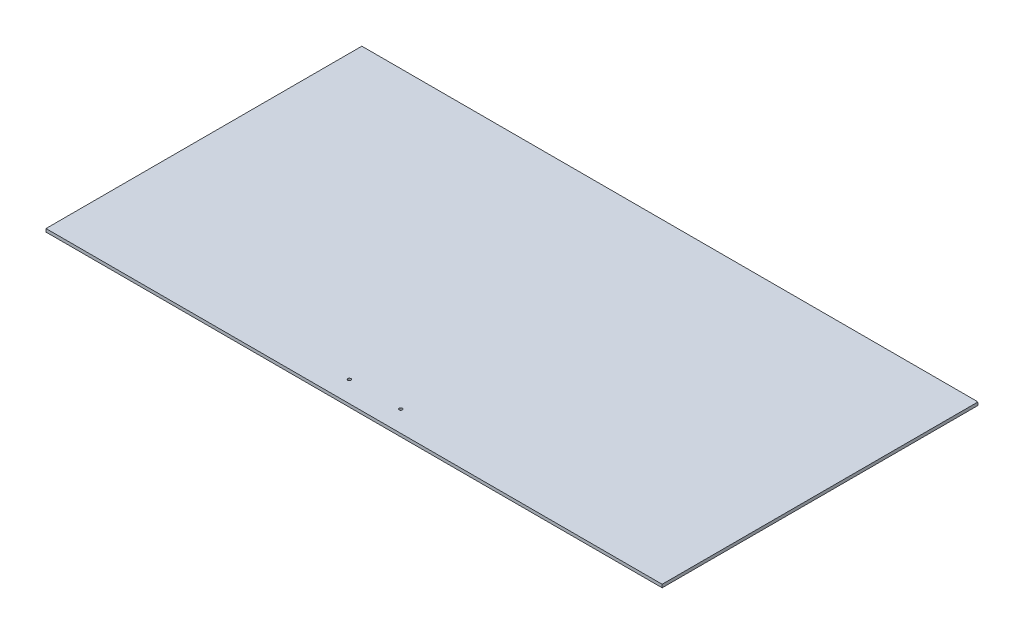
ISO-10303-21;
HEADER;
FILE_DESCRIPTION(('STEP AP214'),'2;1');
FILE_NAME('part.step','',(''),(''),'','','');
FILE_SCHEMA(('AUTOMOTIVE_DESIGN { 1 0 10303 214 1 1 1 1 }'));
ENDSEC;
DATA;
#1=APPLICATION_CONTEXT('core data for automotive mechanical design processes');
#2=APPLICATION_PROTOCOL_DEFINITION('international standard','automotive_design',2000,#1);
#3=PRODUCT_CONTEXT('',#1,'mechanical');
#4=PRODUCT('Part','Part','',(#3));
#5=PRODUCT_RELATED_PRODUCT_CATEGORY('part','',(#4));
#6=PRODUCT_DEFINITION_FORMATION('','',#4);
#7=PRODUCT_DEFINITION_CONTEXT('part definition',#1,'design');
#8=PRODUCT_DEFINITION('design','',#6,#7);
#9=PRODUCT_DEFINITION_SHAPE('','',#8);
#10=(LENGTH_UNIT() NAMED_UNIT(*) SI_UNIT(.MILLI.,.METRE.));
#11=(NAMED_UNIT(*) PLANE_ANGLE_UNIT() SI_UNIT($,.RADIAN.));
#12=(NAMED_UNIT(*) SI_UNIT($,.STERADIAN.) SOLID_ANGLE_UNIT());
#13=UNCERTAINTY_MEASURE_WITH_UNIT(LENGTH_MEASURE(1.E-05),#10,'distance_accuracy_value','');
#14=(GEOMETRIC_REPRESENTATION_CONTEXT(3) GLOBAL_UNCERTAINTY_ASSIGNED_CONTEXT((#13)) GLOBAL_UNIT_ASSIGNED_CONTEXT((#10,
#11,#12)) REPRESENTATION_CONTEXT('',''));
#15=CARTESIAN_POINT('',(0.,0.,0.));
#16=DIRECTION('',(0.,0.,1.));
#17=DIRECTION('',(1.,0.,0.));
#18=AXIS2_PLACEMENT_3D('',#15,#16,#17);
#19=CARTESIAN_POINT('',(628.65,6.35,-322.2625));
#20=DIRECTION('',(-1.,0.,0.));
#21=DIRECTION('',(0.,0.,1.));
#22=AXIS2_PLACEMENT_3D('',#19,#20,#21);
#23=PLANE('',#22);
#24=DIRECTION('',(0.,-1.,0.));
#25=VECTOR('',#24,1.);
#26=CARTESIAN_POINT('',(628.65,6.35,-322.2625));
#27=LINE('',#26,#25);
#28=CARTESIAN_POINT('',(628.65,5.42029547438751,-322.2625));
#29=VERTEX_POINT('',#28);
#30=CARTESIAN_POINT('',(628.65,0.,-322.2625));
#31=VERTEX_POINT('',#30);
#32=EDGE_CURVE('E110',#29,#31,#27,.T.);
#33=ORIENTED_EDGE('',*,*,#32,.F.);
#34=CARTESIAN_POINT('',(628.65,7.62,-323.5325));
#35=DIRECTION('',(1.,0.,0.));
#36=DIRECTION('',(0.,0.,-1.));
#37=AXIS2_PLACEMENT_3D('',#34,#35,#36);
#38=CIRCLE('',#37,2.54000000000001);
#39=CARTESIAN_POINT('',(628.65,6.35,-321.332795474388));
#40=VERTEX_POINT('',#39);
#41=EDGE_CURVE('E102',#40,#29,#38,.T.);
#42=ORIENTED_EDGE('',*,*,#41,.F.);
#43=DIRECTION('',(0.,0.,-1.));
#44=VECTOR('',#43,1.);
#45=CARTESIAN_POINT('',(628.65,6.35,-322.2625));
#46=LINE('',#45,#44);
#47=CARTESIAN_POINT('',(628.65,6.35,322.2625));
#48=VERTEX_POINT('',#47);
#49=EDGE_CURVE('E108',#48,#40,#46,.T.);
#50=ORIENTED_EDGE('',*,*,#49,.F.);
#51=DIRECTION('',(0.,-1.,0.));
#52=VECTOR('',#51,1.);
#53=CARTESIAN_POINT('',(628.65,6.35,322.2625));
#54=LINE('',#53,#52);
#55=CARTESIAN_POINT('',(628.65,0.,322.2625));
#56=VERTEX_POINT('',#55);
#57=EDGE_CURVE('E131',#48,#56,#54,.T.);
#58=ORIENTED_EDGE('',*,*,#57,.T.);
#59=DIRECTION('',(0.,0.,-1.));
#60=VECTOR('',#59,1.);
#61=CARTESIAN_POINT('',(628.65,0.,-322.2625));
#62=LINE('',#61,#60);
#63=EDGE_CURVE('E132',#56,#31,#62,.T.);
#64=ORIENTED_EDGE('',*,*,#63,.T.);
#65=EDGE_LOOP('',(#33,#42,#50,#58,#64));
#66=FACE_BOUND('',#65,.T.);
#67=ADVANCED_FACE('F38',(#66),#23,.F.);
#68=CARTESIAN_POINT('',(-628.65,6.35,-322.2625));
#69=DIRECTION('',(0.,0.,1.));
#70=DIRECTION('',(1.,0.,0.));
#71=AXIS2_PLACEMENT_3D('',#68,#69,#70);
#72=PLANE('',#71);
#73=DIRECTION('',(0.,1.,0.));
#74=VECTOR('',#73,1.);
#75=CARTESIAN_POINT('',(626.11,6.35,-322.2625));
#76=LINE('',#75,#74);
#77=CARTESIAN_POINT('',(626.11,5.42029547438751,-322.2625));
#78=VERTEX_POINT('',#77);
#79=CARTESIAN_POINT('',(626.11,6.35,-322.2625));
#80=VERTEX_POINT('',#79);
#81=EDGE_CURVE('E53',#78,#80,#76,.T.);
#82=ORIENTED_EDGE('',*,*,#81,.F.);
#83=DIRECTION('',(1.,0.,0.));
#84=VECTOR('',#83,1.);
#85=CARTESIAN_POINT('',(626.11,5.42029547438751,-322.2625));
#86=LINE('',#85,#84);
#87=EDGE_CURVE('E249',#78,#29,#86,.T.);
#88=ORIENTED_EDGE('',*,*,#87,.T.);
#89=ORIENTED_EDGE('',*,*,#32,.T.);
#90=DIRECTION('',(-1.,0.,0.));
#91=VECTOR('',#90,1.);
#92=CARTESIAN_POINT('',(-628.65,0.,-322.2625));
#93=LINE('',#92,#91);
#94=CARTESIAN_POINT('',(-628.65,0.,-322.2625));
#95=VERTEX_POINT('',#94);
#96=EDGE_CURVE('E135',#31,#95,#93,.T.);
#97=ORIENTED_EDGE('',*,*,#96,.T.);
#98=DIRECTION('',(0.,-1.,0.));
#99=VECTOR('',#98,1.);
#100=CARTESIAN_POINT('',(-628.65,6.35,-322.2625));
#101=LINE('',#100,#99);
#102=CARTESIAN_POINT('',(-628.65,6.35,-322.2625));
#103=VERTEX_POINT('',#102);
#104=EDGE_CURVE('E146',#103,#95,#101,.T.);
#105=ORIENTED_EDGE('',*,*,#104,.F.);
#106=DIRECTION('',(-1.,0.,0.));
#107=VECTOR('',#106,1.);
#108=CARTESIAN_POINT('',(-628.65,6.35,-322.2625));
#109=LINE('',#108,#107);
#110=EDGE_CURVE('E86',#80,#103,#109,.T.);
#111=ORIENTED_EDGE('',*,*,#110,.F.);
#112=EDGE_LOOP('',(#82,#88,#89,#97,#105,#111));
#113=FACE_BOUND('',#112,.T.);
#114=ADVANCED_FACE('F153',(#113),#72,.F.);
#115=CARTESIAN_POINT('',(-628.65,6.35,-322.2625));
#116=DIRECTION('',(1.,0.,0.));
#117=DIRECTION('',(0.,0.,-1.));
#118=AXIS2_PLACEMENT_3D('',#115,#116,#117);
#119=PLANE('',#118);
#120=DIRECTION('',(0.,0.,1.));
#121=VECTOR('',#120,1.);
#122=CARTESIAN_POINT('',(-628.65,0.,-322.2625));
#123=LINE('',#122,#121);
#124=CARTESIAN_POINT('',(-628.65,0.,322.2625));
#125=VERTEX_POINT('',#124);
#126=EDGE_CURVE('E121',#95,#125,#123,.T.);
#127=ORIENTED_EDGE('',*,*,#126,.T.);
#128=DIRECTION('',(0.,-1.,0.));
#129=VECTOR('',#128,1.);
#130=CARTESIAN_POINT('',(-628.65,6.35,322.2625));
#131=LINE('',#130,#129);
#132=CARTESIAN_POINT('',(-628.65,6.35,322.2625));
#133=VERTEX_POINT('',#132);
#134=EDGE_CURVE('E143',#133,#125,#131,.T.);
#135=ORIENTED_EDGE('',*,*,#134,.F.);
#136=DIRECTION('',(0.,0.,1.));
#137=VECTOR('',#136,1.);
#138=CARTESIAN_POINT('',(-628.65,6.35,-322.2625));
#139=LINE('',#138,#137);
#140=EDGE_CURVE('E119',#103,#133,#139,.T.);
#141=ORIENTED_EDGE('',*,*,#140,.F.);
#142=ORIENTED_EDGE('',*,*,#104,.T.);
#143=EDGE_LOOP('',(#127,#135,#141,#142));
#144=FACE_BOUND('',#143,.T.);
#145=ADVANCED_FACE('F159',(#144),#119,.F.);
#146=CARTESIAN_POINT('',(-628.65,6.35,322.2625));
#147=DIRECTION('',(0.,0.,-1.));
#148=DIRECTION('',(-1.,0.,0.));
#149=AXIS2_PLACEMENT_3D('',#146,#147,#148);
#150=PLANE('',#149);
#151=DIRECTION('',(1.,0.,0.));
#152=VECTOR('',#151,1.);
#153=CARTESIAN_POINT('',(-628.65,0.,322.2625));
#154=LINE('',#153,#152);
#155=EDGE_CURVE('E82',#125,#56,#154,.T.);
#156=ORIENTED_EDGE('',*,*,#155,.T.);
#157=ORIENTED_EDGE('',*,*,#57,.F.);
#158=DIRECTION('',(1.,0.,0.));
#159=VECTOR('',#158,1.);
#160=CARTESIAN_POINT('',(-628.65,6.35,322.2625));
#161=LINE('',#160,#159);
#162=EDGE_CURVE('E62',#133,#48,#161,.T.);
#163=ORIENTED_EDGE('',*,*,#162,.F.);
#164=ORIENTED_EDGE('',*,*,#134,.T.);
#165=EDGE_LOOP('',(#156,#157,#163,#164));
#166=FACE_BOUND('',#165,.T.);
#167=ADVANCED_FACE('F160',(#166),#150,.F.);
#168=CARTESIAN_POINT('',(0.,6.35,0.));
#169=DIRECTION('',(0.,1.,0.));
#170=DIRECTION('',(0.,0.,1.));
#171=AXIS2_PLACEMENT_3D('',#168,#169,#170);
#172=PLANE('',#171);
#173=DIRECTION('',(1.,0.,0.));
#174=VECTOR('',#173,1.);
#175=CARTESIAN_POINT('',(626.11,6.35,-321.332795474388));
#176=LINE('',#175,#174);
#177=CARTESIAN_POINT('',(626.11,6.35,-321.332795474388));
#178=VERTEX_POINT('',#177);
#179=EDGE_CURVE('E11',#178,#40,#176,.T.);
#180=ORIENTED_EDGE('',*,*,#179,.F.);
#181=DIRECTION('',(0.,0.,-1.));
#182=VECTOR('',#181,1.);
#183=CARTESIAN_POINT('',(626.11,6.35,1.07850236677872E-13));
#184=LINE('',#183,#182);
#185=EDGE_CURVE('E46',#178,#80,#184,.T.);
#186=ORIENTED_EDGE('',*,*,#185,.T.);
#187=ORIENTED_EDGE('',*,*,#110,.T.);
#188=ORIENTED_EDGE('',*,*,#140,.T.);
#189=ORIENTED_EDGE('',*,*,#162,.T.);
#190=ORIENTED_EDGE('',*,*,#49,.T.);
#191=EDGE_LOOP('',(#180,#186,#187,#188,#189,#190));
#192=FACE_BOUND('',#191,.T.);
#193=CARTESIAN_POINT('',(-52.3875,6.35,279.4));
#194=DIRECTION('',(0.,1.,0.));
#195=DIRECTION('',(0.,0.,1.));
#196=AXIS2_PLACEMENT_3D('',#193,#194,#195);
#197=CIRCLE('',#196,3.175);
#198=CARTESIAN_POINT('',(-52.3875,6.35,282.575));
#199=VERTEX_POINT('',#198);
#200=EDGE_CURVE('E240',#199,#199,#197,.T.);
#201=ORIENTED_EDGE('',*,*,#200,.F.);
#202=EDGE_LOOP('',(#201));
#203=FACE_BOUND('',#202,.T.);
#204=CARTESIAN_POINT('',(52.3875,6.35,279.4));
#205=DIRECTION('',(0.,1.,0.));
#206=DIRECTION('',(0.,0.,1.));
#207=AXIS2_PLACEMENT_3D('',#204,#205,#206);
#208=CIRCLE('',#207,3.175);
#209=CARTESIAN_POINT('',(52.3875,6.35,282.575));
#210=VERTEX_POINT('',#209);
#211=EDGE_CURVE('E124',#210,#210,#208,.T.);
#212=ORIENTED_EDGE('',*,*,#211,.F.);
#213=EDGE_LOOP('',(#212));
#214=FACE_BOUND('',#213,.T.);
#215=ADVANCED_FACE('F113',(#192,#203,#214),#172,.T.);
#216=CARTESIAN_POINT('',(0.,0.,0.));
#217=DIRECTION('',(0.,1.,0.));
#218=DIRECTION('',(0.,0.,1.));
#219=AXIS2_PLACEMENT_3D('',#216,#217,#218);
#220=PLANE('',#219);
#221=CARTESIAN_POINT('',(-52.3875,0.,279.4));
#222=DIRECTION('',(0.,1.,0.));
#223=DIRECTION('',(0.,0.,1.));
#224=AXIS2_PLACEMENT_3D('',#221,#222,#223);
#225=CIRCLE('',#224,3.175);
#226=CARTESIAN_POINT('',(-52.3875,0.,282.575));
#227=VERTEX_POINT('',#226);
#228=EDGE_CURVE('E136',#227,#227,#225,.T.);
#229=ORIENTED_EDGE('',*,*,#228,.T.);
#230=EDGE_LOOP('',(#229));
#231=FACE_BOUND('',#230,.T.);
#232=CARTESIAN_POINT('',(52.3875,0.,279.4));
#233=DIRECTION('',(0.,1.,0.));
#234=DIRECTION('',(0.,0.,1.));
#235=AXIS2_PLACEMENT_3D('',#232,#233,#234);
#236=CIRCLE('',#235,3.175);
#237=CARTESIAN_POINT('',(52.3875,0.,282.575));
#238=VERTEX_POINT('',#237);
#239=EDGE_CURVE('E242',#238,#238,#236,.T.);
#240=ORIENTED_EDGE('',*,*,#239,.T.);
#241=EDGE_LOOP('',(#240));
#242=FACE_BOUND('',#241,.T.);
#243=ORIENTED_EDGE('',*,*,#63,.F.);
#244=ORIENTED_EDGE('',*,*,#155,.F.);
#245=ORIENTED_EDGE('',*,*,#126,.F.);
#246=ORIENTED_EDGE('',*,*,#96,.F.);
#247=EDGE_LOOP('',(#243,#244,#245,#246));
#248=FACE_BOUND('',#247,.T.);
#249=ADVANCED_FACE('F163',(#231,#242,#248),#220,.F.);
#250=CARTESIAN_POINT('',(52.3875,0.,279.4));
#251=DIRECTION('',(0.,1.,0.));
#252=DIRECTION('',(0.,0.,1.));
#253=AXIS2_PLACEMENT_3D('',#250,#251,#252);
#254=CYLINDRICAL_SURFACE('',#253,3.175);
#255=ORIENTED_EDGE('',*,*,#239,.F.);
#256=EDGE_LOOP('',(#255));
#257=FACE_BOUND('',#256,.T.);
#258=ORIENTED_EDGE('',*,*,#211,.T.);
#259=EDGE_LOOP('',(#258));
#260=FACE_BOUND('',#259,.T.);
#261=ADVANCED_FACE('F165',(#257,#260),#254,.F.);
#262=CARTESIAN_POINT('',(-52.3875,0.,279.4));
#263=DIRECTION('',(0.,1.,0.));
#264=DIRECTION('',(0.,0.,1.));
#265=AXIS2_PLACEMENT_3D('',#262,#263,#264);
#266=CYLINDRICAL_SURFACE('',#265,3.175);
#267=ORIENTED_EDGE('',*,*,#228,.F.);
#268=EDGE_LOOP('',(#267));
#269=FACE_BOUND('',#268,.T.);
#270=ORIENTED_EDGE('',*,*,#200,.T.);
#271=EDGE_LOOP('',(#270));
#272=FACE_BOUND('',#271,.T.);
#273=ADVANCED_FACE('F173',(#269,#272),#266,.F.);
#274=CARTESIAN_POINT('',(626.11,7.62,-323.5325));
#275=DIRECTION('',(1.,0.,0.));
#276=DIRECTION('',(0.,0.,-1.));
#277=AXIS2_PLACEMENT_3D('',#274,#275,#276);
#278=CYLINDRICAL_SURFACE('',#277,2.54000000000001);
#279=CARTESIAN_POINT('',(626.11,7.62,-323.5325));
#280=DIRECTION('',(1.,0.,0.));
#281=DIRECTION('',(0.,0.,-1.));
#282=AXIS2_PLACEMENT_3D('',#279,#280,#281);
#283=CIRCLE('',#282,2.54000000000001);
#284=EDGE_CURVE('E104',#178,#78,#283,.T.);
#285=ORIENTED_EDGE('',*,*,#284,.F.);
#286=ORIENTED_EDGE('',*,*,#179,.T.);
#287=ORIENTED_EDGE('',*,*,#41,.T.);
#288=ORIENTED_EDGE('',*,*,#87,.F.);
#289=EDGE_LOOP('',(#285,#286,#287,#288));
#290=FACE_BOUND('',#289,.T.);
#291=ADVANCED_FACE('F101',(#290),#278,.F.);
#292=CARTESIAN_POINT('',(626.11,7.62,-323.5325));
#293=DIRECTION('',(1.,0.,0.));
#294=DIRECTION('',(0.,0.,-1.));
#295=AXIS2_PLACEMENT_3D('',#292,#293,#294);
#296=PLANE('',#295);
#297=ORIENTED_EDGE('',*,*,#81,.T.);
#298=ORIENTED_EDGE('',*,*,#185,.F.);
#299=ORIENTED_EDGE('',*,*,#284,.T.);
#300=EDGE_LOOP('',(#297,#298,#299));
#301=FACE_BOUND('',#300,.T.);
#302=ADVANCED_FACE('F219',(#301),#296,.T.);
#303=CLOSED_SHELL('',(#67,#114,#145,#167,#215,#249,#261,#273,#291,#302));
#304=MANIFOLD_SOLID_BREP('B2',#303);
#305=ADVANCED_BREP_SHAPE_REPRESENTATION('',(#18,#304),#14);
#306=SHAPE_DEFINITION_REPRESENTATION(#9,#305);
ENDSEC;
END-ISO-10303-21;
